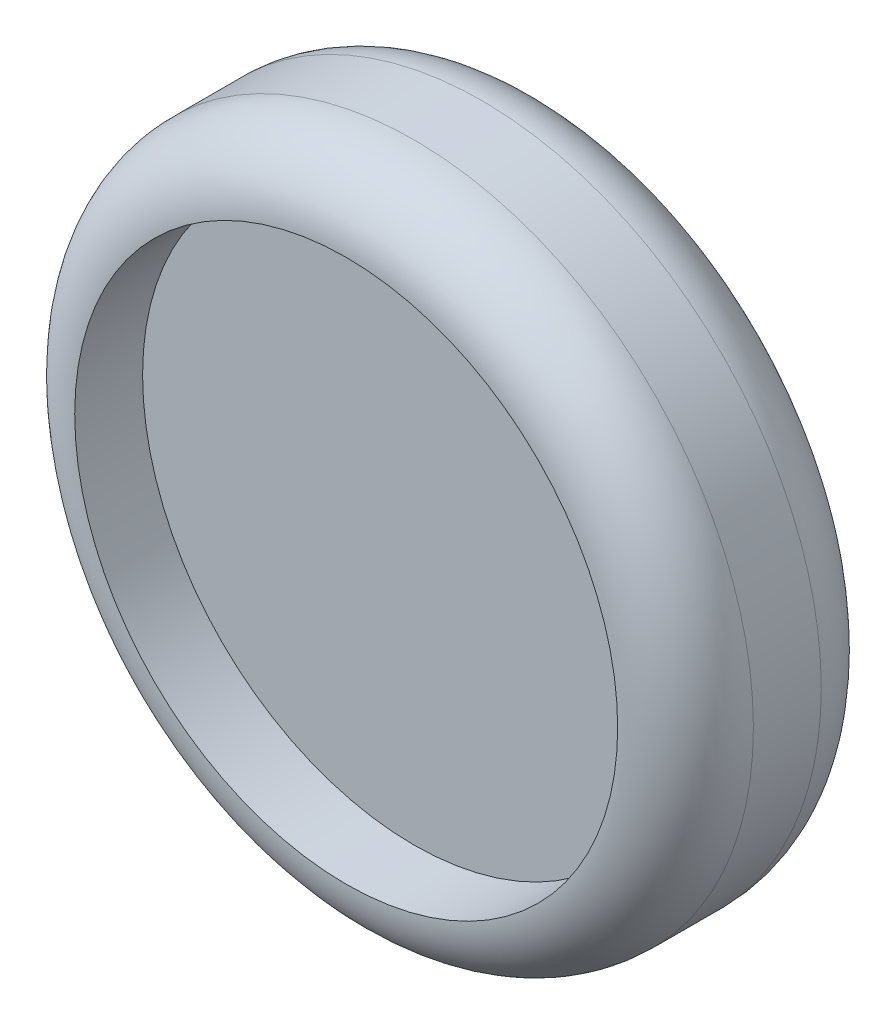
ISO-10303-21;
HEADER;
FILE_DESCRIPTION(('STEP AP214'),'2;1');
FILE_NAME('part.step','',(''),(''),'','','');
FILE_SCHEMA(('AUTOMOTIVE_DESIGN { 1 0 10303 214 1 1 1 1 }'));
ENDSEC;
DATA;
#1=APPLICATION_CONTEXT('core data for automotive mechanical design processes');
#2=APPLICATION_PROTOCOL_DEFINITION('international standard','automotive_design',2000,#1);
#3=PRODUCT_CONTEXT('',#1,'mechanical');
#4=PRODUCT('Part','Part','',(#3));
#5=PRODUCT_RELATED_PRODUCT_CATEGORY('part','',(#4));
#6=PRODUCT_DEFINITION_FORMATION('','',#4);
#7=PRODUCT_DEFINITION_CONTEXT('part definition',#1,'design');
#8=PRODUCT_DEFINITION('design','',#6,#7);
#9=PRODUCT_DEFINITION_SHAPE('','',#8);
#10=(LENGTH_UNIT() NAMED_UNIT(*) SI_UNIT(.MILLI.,.METRE.));
#11=(NAMED_UNIT(*) PLANE_ANGLE_UNIT() SI_UNIT($,.RADIAN.));
#12=(NAMED_UNIT(*) SI_UNIT($,.STERADIAN.) SOLID_ANGLE_UNIT());
#13=UNCERTAINTY_MEASURE_WITH_UNIT(LENGTH_MEASURE(1.E-05),#10,'distance_accuracy_value','');
#14=(GEOMETRIC_REPRESENTATION_CONTEXT(3) GLOBAL_UNCERTAINTY_ASSIGNED_CONTEXT((#13)) GLOBAL_UNIT_ASSIGNED_CONTEXT((#10,
#11,#12)) REPRESENTATION_CONTEXT('',''));
#15=CARTESIAN_POINT('',(0.,0.,0.));
#16=DIRECTION('',(0.,0.,1.));
#17=DIRECTION('',(1.,0.,0.));
#18=AXIS2_PLACEMENT_3D('',#15,#16,#17);
#19=CARTESIAN_POINT('',(0.,0.,45.));
#20=DIRECTION('',(0.,0.,-1.));
#21=DIRECTION('',(-1.,0.,0.));
#22=AXIS2_PLACEMENT_3D('',#19,#20,#21);
#23=CYLINDRICAL_SURFACE('',#22,100.);
#24=CARTESIAN_POINT('',(0.,0.,25.));
#25=DIRECTION('',(0.,0.,1.));
#26=DIRECTION('',(1.,0.,0.));
#27=AXIS2_PLACEMENT_3D('',#24,#25,#26);
#28=CIRCLE('',#27,100.);
#29=CARTESIAN_POINT('',(100.,0.,25.));
#30=VERTEX_POINT('',#29);
#31=EDGE_CURVE('E10',#30,#30,#28,.F.);
#32=ORIENTED_EDGE('',*,*,#31,.T.);
#33=EDGE_LOOP('',(#32));
#34=FACE_BOUND('',#33,.T.);
#35=CARTESIAN_POINT('',(0.,0.,5.00000000000001));
#36=DIRECTION('',(0.,0.,1.));
#37=DIRECTION('',(1.,0.,0.));
#38=AXIS2_PLACEMENT_3D('',#35,#36,#37);
#39=CIRCLE('',#38,100.);
#40=CARTESIAN_POINT('',(100.,0.,5.00000000000001));
#41=VERTEX_POINT('',#40);
#42=EDGE_CURVE('E48',#41,#41,#39,.T.);
#43=ORIENTED_EDGE('',*,*,#42,.T.);
#44=EDGE_LOOP('',(#43));
#45=FACE_BOUND('',#44,.T.);
#46=ADVANCED_FACE('F41',(#34,#45),#23,.T.);
#47=CARTESIAN_POINT('',(0.,0.,25.));
#48=DIRECTION('',(0.,0.,1.));
#49=DIRECTION('',(1.,0.,0.));
#50=AXIS2_PLACEMENT_3D('',#47,#48,#49);
#51=TOROIDAL_SURFACE('',#50,80.,20.);
#52=ORIENTED_EDGE('',*,*,#31,.F.);
#53=EDGE_LOOP('',(#52));
#54=FACE_BOUND('',#53,.T.);
#55=CARTESIAN_POINT('',(0.,0.,45.));
#56=DIRECTION('',(0.,0.,1.));
#57=DIRECTION('',(1.,0.,0.));
#58=AXIS2_PLACEMENT_3D('',#55,#56,#57);
#59=CIRCLE('',#58,80.);
#60=CARTESIAN_POINT('',(80.,0.,45.));
#61=VERTEX_POINT('',#60);
#62=EDGE_CURVE('E56',#61,#61,#59,.T.);
#63=ORIENTED_EDGE('',*,*,#62,.F.);
#64=EDGE_LOOP('',(#63));
#65=FACE_BOUND('',#64,.T.);
#66=ADVANCED_FACE('F80',(#54,#65),#51,.T.);
#67=CARTESIAN_POINT('',(0.,0.,5.00000000000001));
#68=DIRECTION('',(0.,0.,1.));
#69=DIRECTION('',(1.,0.,0.));
#70=AXIS2_PLACEMENT_3D('',#67,#68,#69);
#71=TOROIDAL_SURFACE('',#70,80.,20.);
#72=CARTESIAN_POINT('',(0.,0.,-15.));
#73=DIRECTION('',(0.,0.,-1.));
#74=DIRECTION('',(-1.,0.,0.));
#75=AXIS2_PLACEMENT_3D('',#72,#73,#74);
#76=CIRCLE('',#75,80.);
#77=CARTESIAN_POINT('',(-80.,0.,-15.));
#78=VERTEX_POINT('',#77);
#79=EDGE_CURVE('E62',#78,#78,#76,.T.);
#80=ORIENTED_EDGE('',*,*,#79,.F.);
#81=EDGE_LOOP('',(#80));
#82=FACE_BOUND('',#81,.T.);
#83=ORIENTED_EDGE('',*,*,#42,.F.);
#84=EDGE_LOOP('',(#83));
#85=FACE_BOUND('',#84,.T.);
#86=ADVANCED_FACE('F43',(#82,#85),#71,.T.);
#87=CARTESIAN_POINT('',(0.,0.,25.));
#88=DIRECTION('',(0.,0.,1.));
#89=DIRECTION('',(1.,0.,0.));
#90=AXIS2_PLACEMENT_3D('',#87,#88,#89);
#91=CYLINDRICAL_SURFACE('',#90,80.);
#92=CARTESIAN_POINT('',(0.,0.,25.));
#93=DIRECTION('',(0.,0.,1.));
#94=DIRECTION('',(1.,0.,0.));
#95=AXIS2_PLACEMENT_3D('',#92,#93,#94);
#96=CIRCLE('',#95,80.);
#97=CARTESIAN_POINT('',(80.,0.,25.));
#98=VERTEX_POINT('',#97);
#99=EDGE_CURVE('E52',#98,#98,#96,.T.);
#100=ORIENTED_EDGE('',*,*,#99,.F.);
#101=EDGE_LOOP('',(#100));
#102=FACE_BOUND('',#101,.T.);
#103=ORIENTED_EDGE('',*,*,#62,.T.);
#104=EDGE_LOOP('',(#103));
#105=FACE_BOUND('',#104,.T.);
#106=ADVANCED_FACE('F79',(#102,#105),#91,.F.);
#107=CARTESIAN_POINT('',(0.,0.,25.));
#108=DIRECTION('',(0.,0.,1.));
#109=DIRECTION('',(1.,0.,0.));
#110=AXIS2_PLACEMENT_3D('',#107,#108,#109);
#111=PLANE('',#110);
#112=ORIENTED_EDGE('',*,*,#99,.T.);
#113=EDGE_LOOP('',(#112));
#114=FACE_BOUND('',#113,.T.);
#115=ADVANCED_FACE('F73',(#114),#111,.T.);
#116=CARTESIAN_POINT('',(0.,0.,5.));
#117=DIRECTION('',(0.,0.,-1.));
#118=DIRECTION('',(-1.,0.,0.));
#119=AXIS2_PLACEMENT_3D('',#116,#117,#118);
#120=CYLINDRICAL_SURFACE('',#119,80.);
#121=CARTESIAN_POINT('',(0.,0.,5.));
#122=DIRECTION('',(0.,0.,-1.));
#123=DIRECTION('',(-1.,0.,0.));
#124=AXIS2_PLACEMENT_3D('',#121,#122,#123);
#125=CIRCLE('',#124,80.);
#126=CARTESIAN_POINT('',(-80.,0.,5.));
#127=VERTEX_POINT('',#126);
#128=EDGE_CURVE('E60',#127,#127,#125,.T.);
#129=ORIENTED_EDGE('',*,*,#128,.F.);
#130=EDGE_LOOP('',(#129));
#131=FACE_BOUND('',#130,.T.);
#132=ORIENTED_EDGE('',*,*,#79,.T.);
#133=EDGE_LOOP('',(#132));
#134=FACE_BOUND('',#133,.T.);
#135=ADVANCED_FACE('F70',(#131,#134),#120,.F.);
#136=CARTESIAN_POINT('',(0.,0.,5.));
#137=DIRECTION('',(0.,0.,-1.));
#138=DIRECTION('',(-1.,0.,0.));
#139=AXIS2_PLACEMENT_3D('',#136,#137,#138);
#140=PLANE('',#139);
#141=ORIENTED_EDGE('',*,*,#128,.T.);
#142=EDGE_LOOP('',(#141));
#143=FACE_BOUND('',#142,.T.);
#144=ADVANCED_FACE('F68',(#143),#140,.T.);
#145=CLOSED_SHELL('',(#46,#66,#86,#106,#115,#135,#144));
#146=MANIFOLD_SOLID_BREP('B2',#145);
#147=ADVANCED_BREP_SHAPE_REPRESENTATION('',(#18,#146),#14);
#148=SHAPE_DEFINITION_REPRESENTATION(#9,#147);
ENDSEC;
END-ISO-10303-21;
